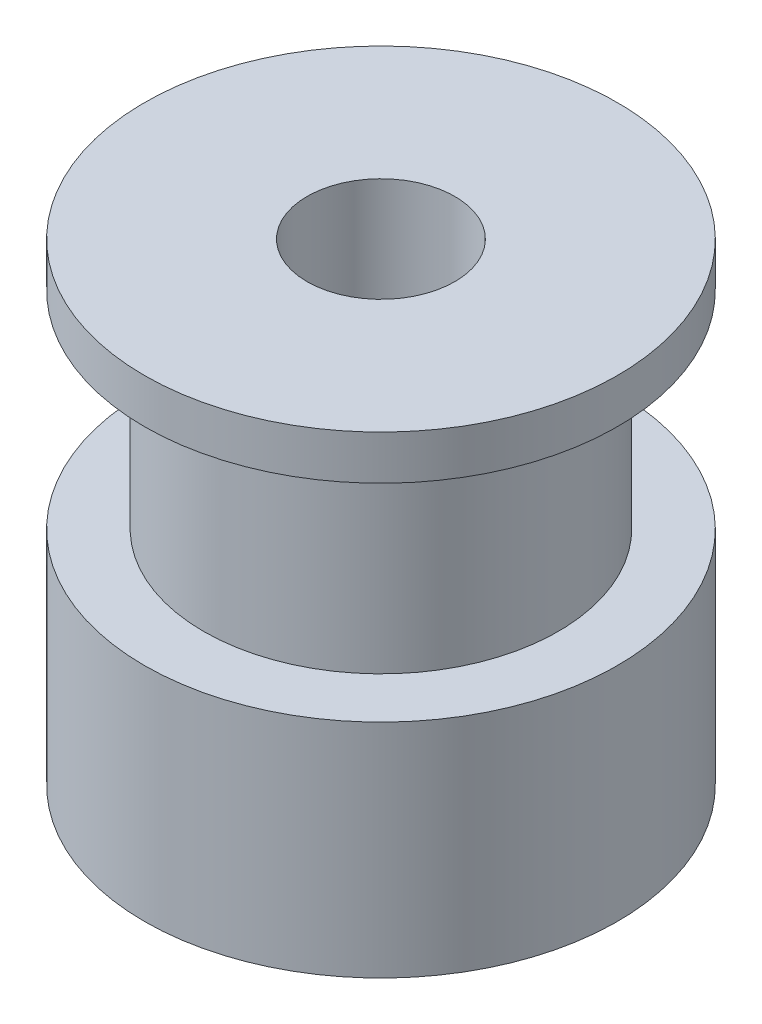
ISO-10303-21;
HEADER;
FILE_DESCRIPTION(('STEP AP214'),'2;1');
FILE_NAME('part.step','',(''),(''),'','','');
FILE_SCHEMA(('AUTOMOTIVE_DESIGN { 1 0 10303 214 1 1 1 1 }'));
ENDSEC;
DATA;
#1=APPLICATION_CONTEXT('core data for automotive mechanical design processes');
#2=APPLICATION_PROTOCOL_DEFINITION('international standard','automotive_design',2000,#1);
#3=PRODUCT_CONTEXT('',#1,'mechanical');
#4=PRODUCT('Part','Part','',(#3));
#5=PRODUCT_RELATED_PRODUCT_CATEGORY('part','',(#4));
#6=PRODUCT_DEFINITION_FORMATION('','',#4);
#7=PRODUCT_DEFINITION_CONTEXT('part definition',#1,'design');
#8=PRODUCT_DEFINITION('design','',#6,#7);
#9=PRODUCT_DEFINITION_SHAPE('','',#8);
#10=(LENGTH_UNIT() NAMED_UNIT(*) SI_UNIT(.MILLI.,.METRE.));
#11=(NAMED_UNIT(*) PLANE_ANGLE_UNIT() SI_UNIT($,.RADIAN.));
#12=(NAMED_UNIT(*) SI_UNIT($,.STERADIAN.) SOLID_ANGLE_UNIT());
#13=UNCERTAINTY_MEASURE_WITH_UNIT(LENGTH_MEASURE(1.E-05),#10,'distance_accuracy_value','');
#14=(GEOMETRIC_REPRESENTATION_CONTEXT(3) GLOBAL_UNCERTAINTY_ASSIGNED_CONTEXT((#13)) GLOBAL_UNIT_ASSIGNED_CONTEXT((#10,
#11,#12)) REPRESENTATION_CONTEXT('',''));
#15=CARTESIAN_POINT('',(0.,0.,0.));
#16=DIRECTION('',(0.,0.,1.));
#17=DIRECTION('',(1.,0.,0.));
#18=AXIS2_PLACEMENT_3D('',#15,#16,#17);
#19=CARTESIAN_POINT('',(0.,15.0123580387965,0.));
#20=DIRECTION('',(0.,1.,0.));
#21=DIRECTION('',(0.,0.,1.));
#22=AXIS2_PLACEMENT_3D('',#19,#20,#21);
#23=CYLINDRICAL_SURFACE('',#22,8.);
#24=CARTESIAN_POINT('',(0.,16.,0.));
#25=DIRECTION('',(0.,1.,0.));
#26=DIRECTION('',(0.,0.,1.));
#27=AXIS2_PLACEMENT_3D('',#24,#25,#26);
#28=CIRCLE('',#27,8.);
#29=CARTESIAN_POINT('',(0.,16.,8.));
#30=VERTEX_POINT('',#29);
#31=EDGE_CURVE('E59',#30,#30,#28,.T.);
#32=ORIENTED_EDGE('',*,*,#31,.F.);
#33=EDGE_LOOP('',(#32));
#34=FACE_BOUND('',#33,.T.);
#35=CARTESIAN_POINT('',(0.,14.5,0.));
#36=DIRECTION('',(0.,1.,0.));
#37=DIRECTION('',(0.,0.,1.));
#38=AXIS2_PLACEMENT_3D('',#35,#36,#37);
#39=CIRCLE('',#38,8.);
#40=CARTESIAN_POINT('',(0.,14.5,8.));
#41=VERTEX_POINT('',#40);
#42=EDGE_CURVE('E10',#41,#41,#39,.T.);
#43=ORIENTED_EDGE('',*,*,#42,.T.);
#44=EDGE_LOOP('',(#43));
#45=FACE_BOUND('',#44,.T.);
#46=ADVANCED_FACE('F31',(#34,#45),#23,.T.);
#47=CARTESIAN_POINT('',(8.,14.5,0.));
#48=DIRECTION('',(0.,1.,0.));
#49=DIRECTION('',(0.,0.,1.));
#50=AXIS2_PLACEMENT_3D('',#47,#48,#49);
#51=PLANE('',#50);
#52=ORIENTED_EDGE('',*,*,#42,.F.);
#53=EDGE_LOOP('',(#52));
#54=FACE_BOUND('',#53,.T.);
#55=CARTESIAN_POINT('',(0.,14.5,0.));
#56=DIRECTION('',(0.,1.,0.));
#57=DIRECTION('',(0.,0.,1.));
#58=AXIS2_PLACEMENT_3D('',#55,#56,#57);
#59=CIRCLE('',#58,6.);
#60=CARTESIAN_POINT('',(0.,14.5,6.));
#61=VERTEX_POINT('',#60);
#62=EDGE_CURVE('E37',#61,#61,#59,.T.);
#63=ORIENTED_EDGE('',*,*,#62,.T.);
#64=EDGE_LOOP('',(#63));
#65=FACE_BOUND('',#64,.T.);
#66=ADVANCED_FACE('F66',(#54,#65),#51,.F.);
#67=CARTESIAN_POINT('',(0.,15.0123580387965,0.));
#68=DIRECTION('',(0.,1.,0.));
#69=DIRECTION('',(0.,0.,1.));
#70=AXIS2_PLACEMENT_3D('',#67,#68,#69);
#71=CYLINDRICAL_SURFACE('',#70,6.);
#72=ORIENTED_EDGE('',*,*,#62,.F.);
#73=EDGE_LOOP('',(#72));
#74=FACE_BOUND('',#73,.T.);
#75=CARTESIAN_POINT('',(0.,7.5,0.));
#76=DIRECTION('',(0.,1.,0.));
#77=DIRECTION('',(0.,0.,1.));
#78=AXIS2_PLACEMENT_3D('',#75,#76,#77);
#79=CIRCLE('',#78,6.);
#80=CARTESIAN_POINT('',(0.,7.5,6.));
#81=VERTEX_POINT('',#80);
#82=EDGE_CURVE('E41',#81,#81,#79,.T.);
#83=ORIENTED_EDGE('',*,*,#82,.T.);
#84=EDGE_LOOP('',(#83));
#85=FACE_BOUND('',#84,.T.);
#86=ADVANCED_FACE('F70',(#74,#85),#71,.T.);
#87=CARTESIAN_POINT('',(6.,7.5,0.));
#88=DIRECTION('',(0.,-1.,0.));
#89=DIRECTION('',(0.,0.,-1.));
#90=AXIS2_PLACEMENT_3D('',#87,#88,#89);
#91=PLANE('',#90);
#92=ORIENTED_EDGE('',*,*,#82,.F.);
#93=EDGE_LOOP('',(#92));
#94=FACE_BOUND('',#93,.T.);
#95=CARTESIAN_POINT('',(0.,7.5,0.));
#96=DIRECTION('',(0.,1.,0.));
#97=DIRECTION('',(0.,0.,1.));
#98=AXIS2_PLACEMENT_3D('',#95,#96,#97);
#99=CIRCLE('',#98,8.);
#100=CARTESIAN_POINT('',(0.,7.5,8.));
#101=VERTEX_POINT('',#100);
#102=EDGE_CURVE('E45',#101,#101,#99,.T.);
#103=ORIENTED_EDGE('',*,*,#102,.T.);
#104=EDGE_LOOP('',(#103));
#105=FACE_BOUND('',#104,.T.);
#106=ADVANCED_FACE('F75',(#94,#105),#91,.F.);
#107=CARTESIAN_POINT('',(0.,15.0123580387965,0.));
#108=DIRECTION('',(0.,1.,0.));
#109=DIRECTION('',(0.,0.,1.));
#110=AXIS2_PLACEMENT_3D('',#107,#108,#109);
#111=CYLINDRICAL_SURFACE('',#110,8.);
#112=ORIENTED_EDGE('',*,*,#102,.F.);
#113=EDGE_LOOP('',(#112));
#114=FACE_BOUND('',#113,.T.);
#115=CARTESIAN_POINT('',(0.,0.,0.));
#116=DIRECTION('',(0.,1.,0.));
#117=DIRECTION('',(0.,0.,1.));
#118=AXIS2_PLACEMENT_3D('',#115,#116,#117);
#119=CIRCLE('',#118,8.);
#120=CARTESIAN_POINT('',(0.,0.,8.));
#121=VERTEX_POINT('',#120);
#122=EDGE_CURVE('E50',#121,#121,#119,.T.);
#123=ORIENTED_EDGE('',*,*,#122,.T.);
#124=EDGE_LOOP('',(#123));
#125=FACE_BOUND('',#124,.T.);
#126=ADVANCED_FACE('F81',(#114,#125),#111,.T.);
#127=CARTESIAN_POINT('',(8.,0.,0.));
#128=DIRECTION('',(0.,1.,0.));
#129=DIRECTION('',(0.,0.,1.));
#130=AXIS2_PLACEMENT_3D('',#127,#128,#129);
#131=PLANE('',#130);
#132=ORIENTED_EDGE('',*,*,#122,.F.);
#133=EDGE_LOOP('',(#132));
#134=FACE_BOUND('',#133,.T.);
#135=CARTESIAN_POINT('',(0.,0.,0.));
#136=DIRECTION('',(0.,1.,0.));
#137=DIRECTION('',(0.,0.,1.));
#138=AXIS2_PLACEMENT_3D('',#135,#136,#137);
#139=CIRCLE('',#138,2.5);
#140=CARTESIAN_POINT('',(0.,0.,2.5));
#141=VERTEX_POINT('',#140);
#142=EDGE_CURVE('E53',#141,#141,#139,.T.);
#143=ORIENTED_EDGE('',*,*,#142,.T.);
#144=EDGE_LOOP('',(#143));
#145=FACE_BOUND('',#144,.T.);
#146=ADVANCED_FACE('F85',(#134,#145),#131,.F.);
#147=CARTESIAN_POINT('',(0.,15.0123580387965,0.));
#148=DIRECTION('',(0.,1.,0.));
#149=DIRECTION('',(0.,0.,1.));
#150=AXIS2_PLACEMENT_3D('',#147,#148,#149);
#151=CYLINDRICAL_SURFACE('',#150,2.5);
#152=ORIENTED_EDGE('',*,*,#142,.F.);
#153=EDGE_LOOP('',(#152));
#154=FACE_BOUND('',#153,.T.);
#155=CARTESIAN_POINT('',(0.,16.,0.));
#156=DIRECTION('',(0.,1.,0.));
#157=DIRECTION('',(0.,0.,1.));
#158=AXIS2_PLACEMENT_3D('',#155,#156,#157);
#159=CIRCLE('',#158,2.5);
#160=CARTESIAN_POINT('',(0.,16.,2.5));
#161=VERTEX_POINT('',#160);
#162=EDGE_CURVE('E56',#161,#161,#159,.T.);
#163=ORIENTED_EDGE('',*,*,#162,.T.);
#164=EDGE_LOOP('',(#163));
#165=FACE_BOUND('',#164,.T.);
#166=ADVANCED_FACE('F89',(#154,#165),#151,.F.);
#167=CARTESIAN_POINT('',(2.5,16.,0.));
#168=DIRECTION('',(0.,-1.,0.));
#169=DIRECTION('',(0.,0.,-1.));
#170=AXIS2_PLACEMENT_3D('',#167,#168,#169);
#171=PLANE('',#170);
#172=ORIENTED_EDGE('',*,*,#162,.F.);
#173=EDGE_LOOP('',(#172));
#174=FACE_BOUND('',#173,.T.);
#175=ORIENTED_EDGE('',*,*,#31,.T.);
#176=EDGE_LOOP('',(#175));
#177=FACE_BOUND('',#176,.T.);
#178=ADVANCED_FACE('F63',(#174,#177),#171,.F.);
#179=CLOSED_SHELL('',(#46,#66,#86,#106,#126,#146,#166,#178));
#180=MANIFOLD_SOLID_BREP('B2',#179);
#181=ADVANCED_BREP_SHAPE_REPRESENTATION('',(#18,#180),#14);
#182=SHAPE_DEFINITION_REPRESENTATION(#9,#181);
ENDSEC;
END-ISO-10303-21;
